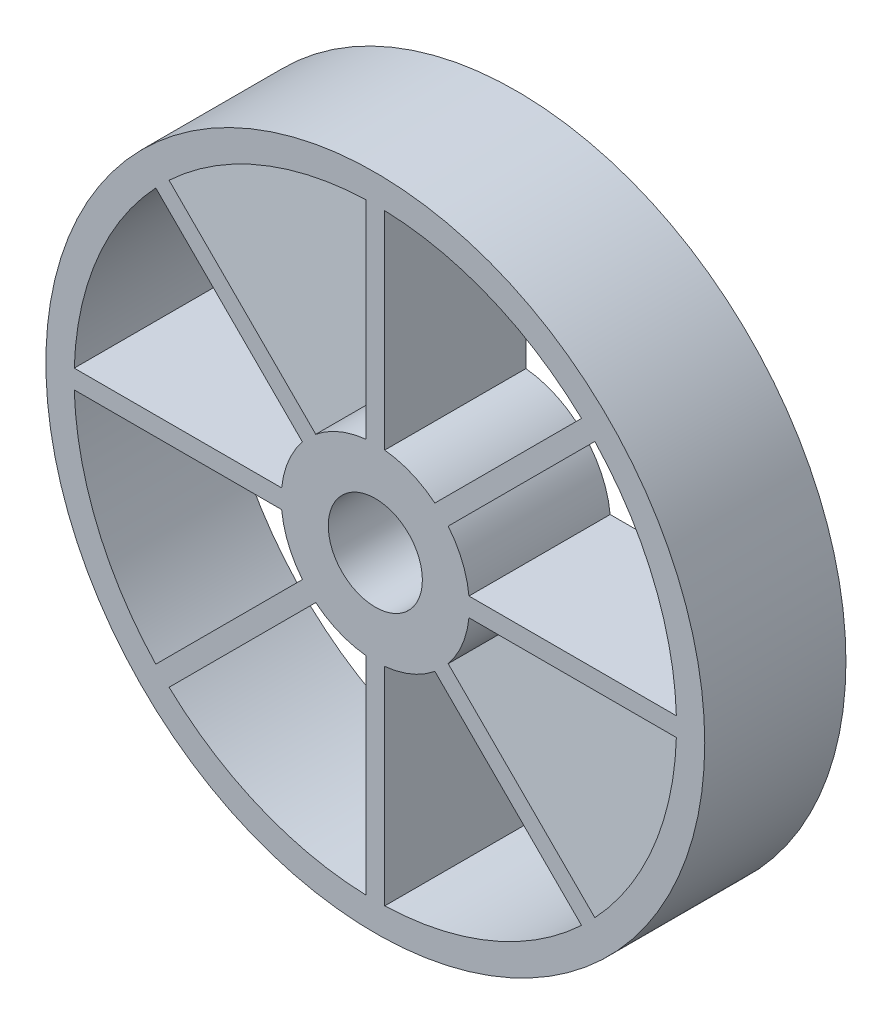
ISO-10303-21;
HEADER;
FILE_DESCRIPTION(('STEP AP214'),'2;1');
FILE_NAME('part.step','',(''),(''),'','','');
FILE_SCHEMA(('AUTOMOTIVE_DESIGN { 1 0 10303 214 1 1 1 1 }'));
ENDSEC;
DATA;
#1=APPLICATION_CONTEXT('core data for automotive mechanical design processes');
#2=APPLICATION_PROTOCOL_DEFINITION('international standard','automotive_design',2000,#1);
#3=PRODUCT_CONTEXT('',#1,'mechanical');
#4=PRODUCT('Part','Part','',(#3));
#5=PRODUCT_RELATED_PRODUCT_CATEGORY('part','',(#4));
#6=PRODUCT_DEFINITION_FORMATION('','',#4);
#7=PRODUCT_DEFINITION_CONTEXT('part definition',#1,'design');
#8=PRODUCT_DEFINITION('design','',#6,#7);
#9=PRODUCT_DEFINITION_SHAPE('','',#8);
#10=(LENGTH_UNIT() NAMED_UNIT(*) SI_UNIT(.MILLI.,.METRE.));
#11=(NAMED_UNIT(*) PLANE_ANGLE_UNIT() SI_UNIT($,.RADIAN.));
#12=(NAMED_UNIT(*) SI_UNIT($,.STERADIAN.) SOLID_ANGLE_UNIT());
#13=UNCERTAINTY_MEASURE_WITH_UNIT(LENGTH_MEASURE(1.E-05),#10,'distance_accuracy_value','');
#14=(GEOMETRIC_REPRESENTATION_CONTEXT(3) GLOBAL_UNCERTAINTY_ASSIGNED_CONTEXT((#13)) GLOBAL_UNIT_ASSIGNED_CONTEXT((#10,
#11,#12)) REPRESENTATION_CONTEXT('',''));
#15=CARTESIAN_POINT('',(0.,0.,0.));
#16=DIRECTION('',(0.,0.,1.));
#17=DIRECTION('',(1.,0.,0.));
#18=AXIS2_PLACEMENT_3D('',#15,#16,#17);
#19=CARTESIAN_POINT('',(0.,0.,15000.));
#20=DIRECTION('',(0.,0.,-1.));
#21=DIRECTION('',(-1.,0.,0.));
#22=AXIS2_PLACEMENT_3D('',#19,#20,#21);
#23=CYLINDRICAL_SURFACE('',#22,10000.);
#24=DIRECTION('',(0.,0.,-1.));
#25=VECTOR('',#24,1.);
#26=CARTESIAN_POINT('',(-7742.73042092175,-6328.51685854853,15000.));
#27=LINE('',#26,#25);
#28=CARTESIAN_POINT('',(-7742.73042092175,-6328.51685854853,15000.));
#29=VERTEX_POINT('',#28);
#30=CARTESIAN_POINT('',(-7742.73042092175,-6328.51685854853,0.));
#31=VERTEX_POINT('',#30);
#32=EDGE_CURVE('E86',#29,#31,#27,.T.);
#33=ORIENTED_EDGE('',*,*,#32,.F.);
#34=CARTESIAN_POINT('',(0.,0.,15000.));
#35=DIRECTION('',(0.,0.,1.));
#36=DIRECTION('',(1.,0.,0.));
#37=AXIS2_PLACEMENT_3D('',#34,#35,#36);
#38=CIRCLE('',#37,10000.);
#39=CARTESIAN_POINT('',(-9949.87437106621,-999.999999999897,15000.));
#40=VERTEX_POINT('',#39);
#41=EDGE_CURVE('E481',#40,#29,#38,.T.);
#42=ORIENTED_EDGE('',*,*,#41,.F.);
#43=DIRECTION('',(0.,0.,-1.));
#44=VECTOR('',#43,1.);
#45=CARTESIAN_POINT('',(-9949.87437106621,-999.999999999897,15000.));
#46=LINE('',#45,#44);
#47=CARTESIAN_POINT('',(-9949.87437106621,-999.999999999897,0.));
#48=VERTEX_POINT('',#47);
#49=EDGE_CURVE('E560',#40,#48,#46,.T.);
#50=ORIENTED_EDGE('',*,*,#49,.T.);
#51=CARTESIAN_POINT('',(0.,0.,0.));
#52=DIRECTION('',(0.,0.,1.));
#53=DIRECTION('',(1.,0.,0.));
#54=AXIS2_PLACEMENT_3D('',#51,#52,#53);
#55=CIRCLE('',#54,10000.);
#56=EDGE_CURVE('E702',#48,#31,#55,.T.);
#57=ORIENTED_EDGE('',*,*,#56,.T.);
#58=EDGE_LOOP('',(#33,#42,#50,#57));
#59=FACE_BOUND('',#58,.T.);
#60=ADVANCED_FACE('F61',(#59),#23,.T.);
#61=CARTESIAN_POINT('',(0.,0.,0.));
#62=DIRECTION('',(0.,0.,1.));
#63=DIRECTION('',(1.,0.,0.));
#64=AXIS2_PLACEMENT_3D('',#61,#62,#63);
#65=CYLINDRICAL_SURFACE('',#64,32000.);
#66=DIRECTION('',(0.,0.,-1.));
#67=VECTOR('',#66,1.);
#68=CARTESIAN_POINT('',(-23323.4725369845,-21909.2589746112,15000.));
#69=LINE('',#68,#67);
#70=CARTESIAN_POINT('',(-23323.4725369845,-21909.2589746112,15000.));
#71=VERTEX_POINT('',#70);
#72=CARTESIAN_POINT('',(-23323.4725369845,-21909.2589746112,0.));
#73=VERTEX_POINT('',#72);
#74=EDGE_CURVE('E277',#71,#73,#69,.T.);
#75=ORIENTED_EDGE('',*,*,#74,.T.);
#76=CARTESIAN_POINT('',(0.,0.,0.));
#77=DIRECTION('',(0.,0.,1.));
#78=DIRECTION('',(1.,0.,0.));
#79=AXIS2_PLACEMENT_3D('',#76,#77,#78);
#80=CIRCLE('',#79,32000.);
#81=CARTESIAN_POINT('',(-31984.371183439,-999.999999999879,0.));
#82=VERTEX_POINT('',#81);
#83=EDGE_CURVE('E289',#82,#73,#80,.T.);
#84=ORIENTED_EDGE('',*,*,#83,.F.);
#85=DIRECTION('',(0.,0.,-1.));
#86=VECTOR('',#85,1.);
#87=CARTESIAN_POINT('',(-31984.3711834398,-999.999999999879,15000.));
#88=LINE('',#87,#86);
#89=CARTESIAN_POINT('',(-31984.3711834398,-999.999999999879,15000.));
#90=VERTEX_POINT('',#89);
#91=EDGE_CURVE('E565',#90,#82,#88,.T.);
#92=ORIENTED_EDGE('',*,*,#91,.F.);
#93=CARTESIAN_POINT('',(0.,0.,15000.));
#94=DIRECTION('',(0.,0.,1.));
#95=DIRECTION('',(1.,0.,0.));
#96=AXIS2_PLACEMENT_3D('',#93,#94,#95);
#97=CIRCLE('',#96,32000.);
#98=EDGE_CURVE('E291',#90,#71,#97,.T.);
#99=ORIENTED_EDGE('',*,*,#98,.T.);
#100=EDGE_LOOP('',(#75,#84,#92,#99));
#101=FACE_BOUND('',#100,.T.);
#102=ADVANCED_FACE('F287',(#101),#65,.F.);
#103=DIRECTION('',(0.,0.,-1.));
#104=VECTOR('',#103,1.);
#105=CARTESIAN_POINT('',(7742.7304209217,6328.51685854858,15000.));
#106=LINE('',#105,#104);
#107=CARTESIAN_POINT('',(7742.7304209217,6328.51685854858,15000.));
#108=VERTEX_POINT('',#107);
#109=CARTESIAN_POINT('',(7742.7304209217,6328.51685854858,0.));
#110=VERTEX_POINT('',#109);
#111=EDGE_CURVE('E704',#108,#110,#106,.T.);
#112=ORIENTED_EDGE('',*,*,#111,.F.);
#113=CARTESIAN_POINT('',(9949.8743710662,999.999999999967,15000.));
#114=VERTEX_POINT('',#113);
#115=EDGE_CURVE('E482',#114,#108,#38,.T.);
#116=ORIENTED_EDGE('',*,*,#115,.F.);
#117=DIRECTION('',(0.,0.,-1.));
#118=VECTOR('',#117,1.);
#119=CARTESIAN_POINT('',(9949.8743710662,999.999999999967,15000.));
#120=LINE('',#119,#118);
#121=CARTESIAN_POINT('',(9949.8743710662,999.999999999967,0.));
#122=VERTEX_POINT('',#121);
#123=EDGE_CURVE('E501',#114,#122,#120,.T.);
#124=ORIENTED_EDGE('',*,*,#123,.T.);
#125=EDGE_CURVE('E657',#122,#110,#55,.T.);
#126=ORIENTED_EDGE('',*,*,#125,.T.);
#127=EDGE_LOOP('',(#112,#116,#124,#126));
#128=FACE_BOUND('',#127,.T.);
#129=ADVANCED_FACE('F403',(#128),#23,.T.);
#130=DIRECTION('',(0.,0.,-1.));
#131=VECTOR('',#130,1.);
#132=CARTESIAN_POINT('',(23323.4725369845,21909.2589746112,15000.));
#133=LINE('',#132,#131);
#134=CARTESIAN_POINT('',(23323.4725369845,21909.2589746112,15000.));
#135=VERTEX_POINT('',#134);
#136=CARTESIAN_POINT('',(23323.4725369845,21909.2589746112,0.));
#137=VERTEX_POINT('',#136);
#138=EDGE_CURVE('E713',#135,#137,#133,.T.);
#139=ORIENTED_EDGE('',*,*,#138,.T.);
#140=CARTESIAN_POINT('',(31984.371183439,999.999999999875,0.));
#141=VERTEX_POINT('',#140);
#142=EDGE_CURVE('E315',#141,#137,#80,.T.);
#143=ORIENTED_EDGE('',*,*,#142,.F.);
#144=DIRECTION('',(0.,0.,-1.));
#145=VECTOR('',#144,1.);
#146=CARTESIAN_POINT('',(31984.3711834398,999.999999999875,15000.));
#147=LINE('',#146,#145);
#148=CARTESIAN_POINT('',(31984.3711834398,999.999999999875,15000.));
#149=VERTEX_POINT('',#148);
#150=EDGE_CURVE('E506',#149,#141,#147,.T.);
#151=ORIENTED_EDGE('',*,*,#150,.F.);
#152=EDGE_CURVE('E632',#149,#135,#97,.T.);
#153=ORIENTED_EDGE('',*,*,#152,.T.);
#154=EDGE_LOOP('',(#139,#143,#151,#153));
#155=FACE_BOUND('',#154,.T.);
#156=ADVANCED_FACE('F408',(#155),#65,.F.);
#157=DIRECTION('',(0.,0.,-1.));
#158=VECTOR('',#157,1.);
#159=CARTESIAN_POINT('',(6328.51685854855,-7742.73042092172,15000.));
#160=LINE('',#159,#158);
#161=CARTESIAN_POINT('',(6328.51685854856,-7742.73042092172,15000.));
#162=VERTEX_POINT('',#161);
#163=CARTESIAN_POINT('',(6328.51685854856,-7742.73042092172,0.));
#164=VERTEX_POINT('',#163);
#165=EDGE_CURVE('E460',#162,#164,#160,.T.);
#166=ORIENTED_EDGE('',*,*,#165,.F.);
#167=CARTESIAN_POINT('',(999.999999999931,-9949.87437106621,15000.));
#168=VERTEX_POINT('',#167);
#169=EDGE_CURVE('E463',#168,#162,#38,.T.);
#170=ORIENTED_EDGE('',*,*,#169,.F.);
#171=DIRECTION('',(0.,0.,-1.));
#172=VECTOR('',#171,1.);
#173=CARTESIAN_POINT('',(999.999999999931,-9949.87437106621,15000.));
#174=LINE('',#173,#172);
#175=CARTESIAN_POINT('',(999.999999999931,-9949.87437106621,0.));
#176=VERTEX_POINT('',#175);
#177=EDGE_CURVE('E532',#168,#176,#174,.T.);
#178=ORIENTED_EDGE('',*,*,#177,.T.);
#179=EDGE_CURVE('E465',#176,#164,#55,.T.);
#180=ORIENTED_EDGE('',*,*,#179,.T.);
#181=EDGE_LOOP('',(#166,#170,#178,#180));
#182=FACE_BOUND('',#181,.T.);
#183=ADVANCED_FACE('F412',(#182),#23,.T.);
#184=DIRECTION('',(0.,0.,-1.));
#185=VECTOR('',#184,1.);
#186=CARTESIAN_POINT('',(21909.2589746112,-23323.4725369845,15000.));
#187=LINE('',#186,#185);
#188=CARTESIAN_POINT('',(21909.2589746112,-23323.4725369845,15000.));
#189=VERTEX_POINT('',#188);
#190=CARTESIAN_POINT('',(21909.2589746112,-23323.4725369845,0.));
#191=VERTEX_POINT('',#190);
#192=EDGE_CURVE('E469',#189,#191,#187,.T.);
#193=ORIENTED_EDGE('',*,*,#192,.T.);
#194=CARTESIAN_POINT('',(999.999999999877,-31984.371183439,0.));
#195=VERTEX_POINT('',#194);
#196=EDGE_CURVE('E304',#195,#191,#80,.T.);
#197=ORIENTED_EDGE('',*,*,#196,.F.);
#198=DIRECTION('',(0.,0.,-1.));
#199=VECTOR('',#198,1.);
#200=CARTESIAN_POINT('',(999.999999999877,-31984.3711834398,15000.));
#201=LINE('',#200,#199);
#202=CARTESIAN_POINT('',(999.999999999877,-31984.3711834398,15000.));
#203=VERTEX_POINT('',#202);
#204=EDGE_CURVE('E536',#203,#195,#201,.T.);
#205=ORIENTED_EDGE('',*,*,#204,.F.);
#206=EDGE_CURVE('E628',#203,#189,#97,.T.);
#207=ORIENTED_EDGE('',*,*,#206,.T.);
#208=EDGE_LOOP('',(#193,#197,#205,#207));
#209=FACE_BOUND('',#208,.T.);
#210=ADVANCED_FACE('F446',(#209),#65,.F.);
#211=CARTESIAN_POINT('',(7742.73042092166,-6328.51685854864,15000.));
#212=VERTEX_POINT('',#211);
#213=CARTESIAN_POINT('',(9949.8743710662,-1000.00000000003,15000.));
#214=VERTEX_POINT('',#213);
#215=EDGE_CURVE('E480',#212,#214,#38,.T.);
#216=ORIENTED_EDGE('',*,*,#215,.F.);
#217=DIRECTION('',(0.,0.,-1.));
#218=VECTOR('',#217,1.);
#219=CARTESIAN_POINT('',(7742.73042092166,-6328.51685854863,15000.));
#220=LINE('',#219,#218);
#221=CARTESIAN_POINT('',(7742.73042092166,-6328.51685854863,0.));
#222=VERTEX_POINT('',#221);
#223=EDGE_CURVE('E488',#212,#222,#220,.T.);
#224=ORIENTED_EDGE('',*,*,#223,.T.);
#225=CARTESIAN_POINT('',(9949.8743710662,-1000.00000000003,0.));
#226=VERTEX_POINT('',#225);
#227=EDGE_CURVE('E658',#222,#226,#55,.T.);
#228=ORIENTED_EDGE('',*,*,#227,.T.);
#229=DIRECTION('',(0.,0.,-1.));
#230=VECTOR('',#229,1.);
#231=CARTESIAN_POINT('',(9949.87437106619,-1000.00000000003,15000.));
#232=LINE('',#231,#230);
#233=EDGE_CURVE('E514',#214,#226,#232,.T.);
#234=ORIENTED_EDGE('',*,*,#233,.F.);
#235=EDGE_LOOP('',(#216,#224,#228,#234));
#236=FACE_BOUND('',#235,.T.);
#237=ADVANCED_FACE('F441',(#236),#23,.T.);
#238=CARTESIAN_POINT('',(23323.4725369837,-21909.2589746108,0.));
#239=VERTEX_POINT('',#238);
#240=CARTESIAN_POINT('',(31984.3711834398,-1000.00000000013,0.));
#241=VERTEX_POINT('',#240);
#242=EDGE_CURVE('E314',#239,#241,#80,.T.);
#243=ORIENTED_EDGE('',*,*,#242,.F.);
#244=DIRECTION('',(0.,0.,-1.));
#245=VECTOR('',#244,1.);
#246=CARTESIAN_POINT('',(23323.4725369843,-21909.2589746114,15000.));
#247=LINE('',#246,#245);
#248=CARTESIAN_POINT('',(23323.4725369843,-21909.2589746114,15000.));
#249=VERTEX_POINT('',#248);
#250=EDGE_CURVE('E495',#249,#239,#247,.T.);
#251=ORIENTED_EDGE('',*,*,#250,.F.);
#252=CARTESIAN_POINT('',(31984.3711834398,-1000.00000000013,15000.));
#253=VERTEX_POINT('',#252);
#254=EDGE_CURVE('E631',#249,#253,#97,.T.);
#255=ORIENTED_EDGE('',*,*,#254,.T.);
#256=DIRECTION('',(0.,0.,-1.));
#257=VECTOR('',#256,1.);
#258=CARTESIAN_POINT('',(31984.3711834398,-1000.00000000013,15000.));
#259=LINE('',#258,#257);
#260=EDGE_CURVE('E510',#253,#241,#259,.T.);
#261=ORIENTED_EDGE('',*,*,#260,.T.);
#262=EDGE_LOOP('',(#243,#251,#255,#261));
#263=FACE_BOUND('',#262,.T.);
#264=ADVANCED_FACE('F439',(#263),#65,.F.);
#265=CARTESIAN_POINT('',(-6328.51685854866,-7742.73042092164,15000.));
#266=VERTEX_POINT('',#265);
#267=CARTESIAN_POINT('',(-1000.00000000007,-9949.87437106619,15000.));
#268=VERTEX_POINT('',#267);
#269=EDGE_CURVE('E72',#266,#268,#38,.T.);
#270=ORIENTED_EDGE('',*,*,#269,.F.);
#271=DIRECTION('',(0.,0.,-1.));
#272=VECTOR('',#271,1.);
#273=CARTESIAN_POINT('',(-6328.51685854866,-7742.73042092164,15000.));
#274=LINE('',#273,#272);
#275=CARTESIAN_POINT('',(-6328.51685854866,-7742.73042092164,0.));
#276=VERTEX_POINT('',#275);
#277=EDGE_CURVE('E779',#266,#276,#274,.T.);
#278=ORIENTED_EDGE('',*,*,#277,.T.);
#279=CARTESIAN_POINT('',(-1000.00000000007,-9949.87437106619,0.));
#280=VERTEX_POINT('',#279);
#281=EDGE_CURVE('E659',#276,#280,#55,.T.);
#282=ORIENTED_EDGE('',*,*,#281,.T.);
#283=DIRECTION('',(0.,0.,-1.));
#284=VECTOR('',#283,1.);
#285=CARTESIAN_POINT('',(-1000.00000000007,-9949.87437106619,15000.));
#286=LINE('',#285,#284);
#287=EDGE_CURVE('E526',#268,#280,#286,.T.);
#288=ORIENTED_EDGE('',*,*,#287,.F.);
#289=EDGE_LOOP('',(#270,#278,#282,#288));
#290=FACE_BOUND('',#289,.T.);
#291=ADVANCED_FACE('F434',(#290),#23,.T.);
#292=CARTESIAN_POINT('',(-21909.2589746108,-23323.4725369837,0.));
#293=VERTEX_POINT('',#292);
#294=CARTESIAN_POINT('',(-1000.00000000013,-31984.3711834398,0.));
#295=VERTEX_POINT('',#294);
#296=EDGE_CURVE('E302',#293,#295,#80,.T.);
#297=ORIENTED_EDGE('',*,*,#296,.F.);
#298=DIRECTION('',(0.,0.,-1.));
#299=VECTOR('',#298,1.);
#300=CARTESIAN_POINT('',(-21909.2589746114,-23323.4725369843,15000.));
#301=LINE('',#300,#299);
#302=CARTESIAN_POINT('',(-21909.2589746114,-23323.4725369843,15000.));
#303=VERTEX_POINT('',#302);
#304=EDGE_CURVE('E293',#303,#293,#301,.T.);
#305=ORIENTED_EDGE('',*,*,#304,.F.);
#306=CARTESIAN_POINT('',(-1000.00000000013,-31984.3711834398,15000.));
#307=VERTEX_POINT('',#306);
#308=EDGE_CURVE('E341',#303,#307,#97,.T.);
#309=ORIENTED_EDGE('',*,*,#308,.T.);
#310=DIRECTION('',(0.,0.,-1.));
#311=VECTOR('',#310,1.);
#312=CARTESIAN_POINT('',(-1000.00000000013,-31984.3711834398,15000.));
#313=LINE('',#312,#311);
#314=EDGE_CURVE('E540',#307,#295,#313,.T.);
#315=ORIENTED_EDGE('',*,*,#314,.T.);
#316=EDGE_LOOP('',(#297,#305,#309,#315));
#317=FACE_BOUND('',#316,.T.);
#318=ADVANCED_FACE('F431',(#317),#65,.F.);
#319=DIRECTION('',(0.,0.,-1.));
#320=VECTOR('',#319,1.);
#321=CARTESIAN_POINT('',(-9949.87437106619,1000.0000000001,15000.));
#322=LINE('',#321,#320);
#323=CARTESIAN_POINT('',(-9949.87437106619,1000.0000000001,15000.));
#324=VERTEX_POINT('',#323);
#325=CARTESIAN_POINT('',(-9949.87437106619,1000.0000000001,0.));
#326=VERTEX_POINT('',#325);
#327=EDGE_CURVE('E554',#324,#326,#322,.T.);
#328=ORIENTED_EDGE('',*,*,#327,.F.);
#329=CARTESIAN_POINT('',(-7742.73042092161,6328.51685854869,15000.));
#330=VERTEX_POINT('',#329);
#331=EDGE_CURVE('E71',#330,#324,#38,.T.);
#332=ORIENTED_EDGE('',*,*,#331,.F.);
#333=DIRECTION('',(0.,0.,-1.));
#334=VECTOR('',#333,1.);
#335=CARTESIAN_POINT('',(-7742.73042092161,6328.51685854869,15000.));
#336=LINE('',#335,#334);
#337=CARTESIAN_POINT('',(-7742.73042092161,6328.51685854869,0.));
#338=VERTEX_POINT('',#337);
#339=EDGE_CURVE('E586',#330,#338,#336,.T.);
#340=ORIENTED_EDGE('',*,*,#339,.T.);
#341=EDGE_CURVE('E760',#338,#326,#55,.T.);
#342=ORIENTED_EDGE('',*,*,#341,.T.);
#343=EDGE_LOOP('',(#328,#332,#340,#342));
#344=FACE_BOUND('',#343,.T.);
#345=ADVANCED_FACE('F426',(#344),#23,.T.);
#346=DIRECTION('',(0.,0.,-1.));
#347=VECTOR('',#346,1.);
#348=CARTESIAN_POINT('',(-31984.3711834398,1000.00000000011,15000.));
#349=LINE('',#348,#347);
#350=CARTESIAN_POINT('',(-31984.3711834398,1000.00000000011,15000.));
#351=VERTEX_POINT('',#350);
#352=CARTESIAN_POINT('',(-31984.3711834398,1000.00000000011,0.));
#353=VERTEX_POINT('',#352);
#354=EDGE_CURVE('E568',#351,#353,#349,.T.);
#355=ORIENTED_EDGE('',*,*,#354,.T.);
#356=CARTESIAN_POINT('',(-23323.4725369837,21909.2589746108,0.));
#357=VERTEX_POINT('',#356);
#358=EDGE_CURVE('E301',#357,#353,#80,.T.);
#359=ORIENTED_EDGE('',*,*,#358,.F.);
#360=DIRECTION('',(0.,0.,-1.));
#361=VECTOR('',#360,1.);
#362=CARTESIAN_POINT('',(-23323.4725369843,21909.2589746114,15000.));
#363=LINE('',#362,#361);
#364=CARTESIAN_POINT('',(-23323.4725369843,21909.2589746114,15000.));
#365=VERTEX_POINT('',#364);
#366=EDGE_CURVE('E591',#365,#357,#363,.T.);
#367=ORIENTED_EDGE('',*,*,#366,.F.);
#368=EDGE_CURVE('E339',#365,#351,#97,.T.);
#369=ORIENTED_EDGE('',*,*,#368,.T.);
#370=EDGE_LOOP('',(#355,#359,#367,#369));
#371=FACE_BOUND('',#370,.T.);
#372=ADVANCED_FACE('F423',(#371),#65,.F.);
#373=DIRECTION('',(0.,0.,-1.));
#374=VECTOR('',#373,1.);
#375=CARTESIAN_POINT('',(-6328.5168585485,7742.73042092177,15000.));
#376=LINE('',#375,#374);
#377=CARTESIAN_POINT('',(-6328.5168585485,7742.73042092177,15000.));
#378=VERTEX_POINT('',#377);
#379=CARTESIAN_POINT('',(-6328.5168585485,7742.73042092177,0.));
#380=VERTEX_POINT('',#379);
#381=EDGE_CURVE('E581',#378,#380,#376,.T.);
#382=ORIENTED_EDGE('',*,*,#381,.F.);
#383=CARTESIAN_POINT('',(-1000.,9949.8743710662,15000.));
#384=VERTEX_POINT('',#383);
#385=EDGE_CURVE('E12',#384,#378,#38,.T.);
#386=ORIENTED_EDGE('',*,*,#385,.F.);
#387=DIRECTION('',(0.,0.,-1.));
#388=VECTOR('',#387,1.);
#389=CARTESIAN_POINT('',(-999.999999999999,9949.8743710662,15000.));
#390=LINE('',#389,#388);
#391=CARTESIAN_POINT('',(-999.999999999999,9949.8743710662,0.));
#392=VERTEX_POINT('',#391);
#393=EDGE_CURVE('E364',#384,#392,#390,.T.);
#394=ORIENTED_EDGE('',*,*,#393,.T.);
#395=EDGE_CURVE('E65',#392,#380,#55,.T.);
#396=ORIENTED_EDGE('',*,*,#395,.T.);
#397=EDGE_LOOP('',(#382,#386,#394,#396));
#398=FACE_BOUND('',#397,.T.);
#399=ADVANCED_FACE('F416',(#398),#23,.T.);
#400=DIRECTION('',(0.,0.,-1.));
#401=VECTOR('',#400,1.);
#402=CARTESIAN_POINT('',(-21909.2589746113,23323.4725369845,15000.));
#403=LINE('',#402,#401);
#404=CARTESIAN_POINT('',(-21909.2589746113,23323.4725369845,15000.));
#405=VERTEX_POINT('',#404);
#406=CARTESIAN_POINT('',(-21909.2589746113,23323.4725369845,0.));
#407=VERTEX_POINT('',#406);
#408=EDGE_CURVE('E595',#405,#407,#403,.T.);
#409=ORIENTED_EDGE('',*,*,#408,.T.);
#410=CARTESIAN_POINT('',(-999.999999999873,31984.3711834398,0.));
#411=VERTEX_POINT('',#410);
#412=EDGE_CURVE('E308',#411,#407,#80,.T.);
#413=ORIENTED_EDGE('',*,*,#412,.F.);
#414=DIRECTION('',(0.,0.,-1.));
#415=VECTOR('',#414,1.);
#416=CARTESIAN_POINT('',(-999.999999999873,31984.3711834398,15000.));
#417=LINE('',#416,#415);
#418=CARTESIAN_POINT('',(-999.999999999873,31984.371183439,15000.));
#419=VERTEX_POINT('',#418);
#420=EDGE_CURVE('E368',#419,#411,#417,.T.);
#421=ORIENTED_EDGE('',*,*,#420,.F.);
#422=EDGE_CURVE('E333',#419,#405,#97,.T.);
#423=ORIENTED_EDGE('',*,*,#422,.T.);
#424=EDGE_LOOP('',(#409,#413,#421,#423));
#425=FACE_BOUND('',#424,.T.);
#426=ADVANCED_FACE('F414',(#425),#65,.F.);
#427=CARTESIAN_POINT('',(6328.51685854861,7742.73042092168,15000.));
#428=VERTEX_POINT('',#427);
#429=CARTESIAN_POINT('',(1000.,9949.8743710662,15000.));
#430=VERTEX_POINT('',#429);
#431=EDGE_CURVE('E651',#428,#430,#38,.T.);
#432=ORIENTED_EDGE('',*,*,#431,.F.);
#433=DIRECTION('',(0.,0.,-1.));
#434=VECTOR('',#433,1.);
#435=CARTESIAN_POINT('',(6328.51685854861,7742.73042092168,15000.));
#436=LINE('',#435,#434);
#437=CARTESIAN_POINT('',(6328.51685854861,7742.73042092168,0.));
#438=VERTEX_POINT('',#437);
#439=EDGE_CURVE('E661',#428,#438,#436,.T.);
#440=ORIENTED_EDGE('',*,*,#439,.T.);
#441=CARTESIAN_POINT('',(1000.,9949.8743710662,0.));
#442=VERTEX_POINT('',#441);
#443=EDGE_CURVE('E380',#438,#442,#55,.T.);
#444=ORIENTED_EDGE('',*,*,#443,.T.);
#445=DIRECTION('',(0.,0.,-1.));
#446=VECTOR('',#445,1.);
#447=CARTESIAN_POINT('',(1000.,9949.8743710662,15000.));
#448=LINE('',#447,#446);
#449=EDGE_CURVE('E352',#430,#442,#448,.T.);
#450=ORIENTED_EDGE('',*,*,#449,.F.);
#451=EDGE_LOOP('',(#432,#440,#444,#450));
#452=FACE_BOUND('',#451,.T.);
#453=ADVANCED_FACE('F63',(#452),#23,.T.);
#454=CARTESIAN_POINT('',(0.,0.,15000.));
#455=DIRECTION('',(0.,0.,1.));
#456=DIRECTION('',(1.,0.,0.));
#457=AXIS2_PLACEMENT_3D('',#454,#455,#456);
#458=PLANE('',#457);
#459=DIRECTION('',(-0.707106781186549,-0.707106781186546,0.));
#460=VECTOR('',#459,1.);
#461=CARTESIAN_POINT('',(-6328.51685854866,-7742.73042092164,15000.));
#462=LINE('',#461,#460);
#463=EDGE_CURVE('E283',#266,#303,#462,.T.);
#464=ORIENTED_EDGE('',*,*,#463,.F.);
#465=ORIENTED_EDGE('',*,*,#269,.T.);
#466=DIRECTION('',(0.,-1.,0.));
#467=VECTOR('',#466,1.);
#468=CARTESIAN_POINT('',(-1000.00000000007,-9949.87437106619,15000.));
#469=LINE('',#468,#467);
#470=EDGE_CURVE('E535',#268,#307,#469,.T.);
#471=ORIENTED_EDGE('',*,*,#470,.T.);
#472=ORIENTED_EDGE('',*,*,#308,.F.);
#473=EDGE_LOOP('',(#464,#465,#471,#472));
#474=FACE_BOUND('',#473,.T.);
#475=DIRECTION('',(0.707106781186551,0.707106781186544,0.));
#476=VECTOR('',#475,1.);
#477=CARTESIAN_POINT('',(6328.51685854861,7742.73042092168,15000.));
#478=LINE('',#477,#476);
#479=CARTESIAN_POINT('',(21909.2589746114,23323.4725369843,15000.));
#480=VERTEX_POINT('',#479);
#481=EDGE_CURVE('E671',#428,#480,#478,.T.);
#482=ORIENTED_EDGE('',*,*,#481,.F.);
#483=ORIENTED_EDGE('',*,*,#431,.T.);
#484=DIRECTION('',(0.,1.,0.));
#485=VECTOR('',#484,1.);
#486=CARTESIAN_POINT('',(1000.,9949.8743710662,15000.));
#487=LINE('',#486,#485);
#488=CARTESIAN_POINT('',(1000.0000000001,31984.371183439,15000.));
#489=VERTEX_POINT('',#488);
#490=EDGE_CURVE('E343',#430,#489,#487,.T.);
#491=ORIENTED_EDGE('',*,*,#490,.T.);
#492=EDGE_CURVE('E609',#480,#489,#97,.T.);
#493=ORIENTED_EDGE('',*,*,#492,.F.);
#494=EDGE_LOOP('',(#482,#483,#491,#493));
#495=FACE_BOUND('',#494,.T.);
#496=DIRECTION('',(0.707106781186545,-0.70710678118655,0.));
#497=VECTOR('',#496,1.);
#498=CARTESIAN_POINT('',(7742.73042092166,-6328.51685854863,15000.));
#499=LINE('',#498,#497);
#500=EDGE_CURVE('E487',#212,#249,#499,.T.);
#501=ORIENTED_EDGE('',*,*,#500,.F.);
#502=ORIENTED_EDGE('',*,*,#215,.T.);
#503=DIRECTION('',(1.,0.,0.));
#504=VECTOR('',#503,1.);
#505=CARTESIAN_POINT('',(9949.87437106619,-1000.00000000003,15000.));
#506=LINE('',#505,#504);
#507=EDGE_CURVE('E505',#214,#253,#506,.T.);
#508=ORIENTED_EDGE('',*,*,#507,.T.);
#509=ORIENTED_EDGE('',*,*,#254,.F.);
#510=EDGE_LOOP('',(#501,#502,#508,#509));
#511=FACE_BOUND('',#510,.T.);
#512=DIRECTION('',(1.,0.,0.));
#513=VECTOR('',#512,1.);
#514=CARTESIAN_POINT('',(9949.8743710662,999.999999999967,15000.));
#515=LINE('',#514,#513);
#516=EDGE_CURVE('E523',#114,#149,#515,.T.);
#517=ORIENTED_EDGE('',*,*,#516,.F.);
#518=ORIENTED_EDGE('',*,*,#115,.T.);
#519=DIRECTION('',(0.707106781186551,0.707106781186544,0.));
#520=VECTOR('',#519,1.);
#521=CARTESIAN_POINT('',(7742.7304209217,6328.51685854858,15000.));
#522=LINE('',#521,#520);
#523=EDGE_CURVE('E664',#108,#135,#522,.T.);
#524=ORIENTED_EDGE('',*,*,#523,.T.);
#525=ORIENTED_EDGE('',*,*,#152,.F.);
#526=EDGE_LOOP('',(#517,#518,#524,#525));
#527=FACE_BOUND('',#526,.T.);
#528=DIRECTION('',(0.,-1.,0.));
#529=VECTOR('',#528,1.);
#530=CARTESIAN_POINT('',(999.999999999931,-9949.87437106621,15000.));
#531=LINE('',#530,#529);
#532=EDGE_CURVE('E478',#168,#203,#531,.T.);
#533=ORIENTED_EDGE('',*,*,#532,.F.);
#534=ORIENTED_EDGE('',*,*,#169,.T.);
#535=DIRECTION('',(0.707106781186545,-0.70710678118655,0.));
#536=VECTOR('',#535,1.);
#537=CARTESIAN_POINT('',(6328.51685854855,-7742.73042092172,15000.));
#538=LINE('',#537,#536);
#539=EDGE_CURVE('E476',#162,#189,#538,.T.);
#540=ORIENTED_EDGE('',*,*,#539,.T.);
#541=ORIENTED_EDGE('',*,*,#206,.F.);
#542=EDGE_LOOP('',(#533,#534,#540,#541));
#543=FACE_BOUND('',#542,.T.);
#544=DIRECTION('',(-1.,0.,0.));
#545=VECTOR('',#544,1.);
#546=CARTESIAN_POINT('',(-9949.87437106621,-999.999999999897,15000.));
#547=LINE('',#546,#545);
#548=EDGE_CURVE('E578',#40,#90,#547,.T.);
#549=ORIENTED_EDGE('',*,*,#548,.F.);
#550=ORIENTED_EDGE('',*,*,#41,.T.);
#551=DIRECTION('',(-0.707106781186549,-0.707106781186546,0.));
#552=VECTOR('',#551,1.);
#553=CARTESIAN_POINT('',(-7742.73042092175,-6328.51685854853,15000.));
#554=LINE('',#553,#552);
#555=EDGE_CURVE('E777',#29,#71,#554,.T.);
#556=ORIENTED_EDGE('',*,*,#555,.T.);
#557=ORIENTED_EDGE('',*,*,#98,.F.);
#558=EDGE_LOOP('',(#549,#550,#556,#557));
#559=FACE_BOUND('',#558,.T.);
#560=DIRECTION('',(-0.707106781186548,0.707106781186547,0.));
#561=VECTOR('',#560,1.);
#562=CARTESIAN_POINT('',(-7742.73042092161,6328.51685854869,15000.));
#563=LINE('',#562,#561);
#564=EDGE_CURVE('E606',#330,#365,#563,.T.);
#565=ORIENTED_EDGE('',*,*,#564,.F.);
#566=ORIENTED_EDGE('',*,*,#331,.T.);
#567=DIRECTION('',(-1.,0.,0.));
#568=VECTOR('',#567,1.);
#569=CARTESIAN_POINT('',(-9949.87437106619,1000.0000000001,15000.));
#570=LINE('',#569,#568);
#571=EDGE_CURVE('E564',#324,#351,#570,.T.);
#572=ORIENTED_EDGE('',*,*,#571,.T.);
#573=ORIENTED_EDGE('',*,*,#368,.F.);
#574=EDGE_LOOP('',(#565,#566,#572,#573));
#575=FACE_BOUND('',#574,.T.);
#576=ORIENTED_EDGE('',*,*,#385,.T.);
#577=DIRECTION('',(-0.707106781186548,0.707106781186547,0.));
#578=VECTOR('',#577,1.);
#579=CARTESIAN_POINT('',(-6328.5168585485,7742.73042092177,15000.));
#580=LINE('',#579,#578);
#581=EDGE_CURVE('E590',#378,#405,#580,.T.);
#582=ORIENTED_EDGE('',*,*,#581,.T.);
#583=ORIENTED_EDGE('',*,*,#422,.F.);
#584=DIRECTION('',(0.,1.,0.));
#585=VECTOR('',#584,1.);
#586=CARTESIAN_POINT('',(-1000.,9949.8743710662,15000.));
#587=LINE('',#586,#585);
#588=EDGE_CURVE('E347',#384,#419,#587,.T.);
#589=ORIENTED_EDGE('',*,*,#588,.F.);
#590=EDGE_LOOP('',(#576,#582,#583,#589));
#591=FACE_BOUND('',#590,.T.);
#592=CARTESIAN_POINT('',(0.,0.,15000.));
#593=DIRECTION('',(0.,0.,1.));
#594=DIRECTION('',(1.,0.,0.));
#595=AXIS2_PLACEMENT_3D('',#592,#593,#594);
#596=CIRCLE('',#595,5000.);
#597=CARTESIAN_POINT('',(5000.,0.,15000.));
#598=VERTEX_POINT('',#597);
#599=EDGE_CURVE('E376',#598,#598,#596,.T.);
#600=ORIENTED_EDGE('',*,*,#599,.F.);
#601=EDGE_LOOP('',(#600));
#602=FACE_BOUND('',#601,.T.);
#603=CARTESIAN_POINT('',(0.,0.,15000.));
#604=DIRECTION('',(0.,0.,1.));
#605=DIRECTION('',(1.,0.,0.));
#606=AXIS2_PLACEMENT_3D('',#603,#604,#605);
#607=CIRCLE('',#606,35000.);
#608=CARTESIAN_POINT('',(35000.,0.,15000.));
#609=VERTEX_POINT('',#608);
#610=EDGE_CURVE('E326',#609,#609,#607,.T.);
#611=ORIENTED_EDGE('',*,*,#610,.T.);
#612=EDGE_LOOP('',(#611));
#613=FACE_BOUND('',#612,.T.);
#614=ADVANCED_FACE('F399',(#474,#495,#511,#527,#543,#559,#575,#591,#602,#613),#458,.T.);
#615=CARTESIAN_POINT('',(0.,0.,0.));
#616=DIRECTION('',(0.,0.,1.));
#617=DIRECTION('',(1.,0.,0.));
#618=AXIS2_PLACEMENT_3D('',#615,#616,#617);
#619=PLANE('',#618);
#620=ORIENTED_EDGE('',*,*,#281,.F.);
#621=DIRECTION('',(-0.707106781186549,-0.707106781186546,0.));
#622=VECTOR('',#621,1.);
#623=CARTESIAN_POINT('',(-6328.51685854866,-7742.73042092164,0.));
#624=LINE('',#623,#622);
#625=EDGE_CURVE('E282',#276,#293,#624,.T.);
#626=ORIENTED_EDGE('',*,*,#625,.T.);
#627=ORIENTED_EDGE('',*,*,#296,.T.);
#628=DIRECTION('',(0.,-1.,0.));
#629=VECTOR('',#628,1.);
#630=CARTESIAN_POINT('',(-1000.00000000007,-9949.87437106619,0.));
#631=LINE('',#630,#629);
#632=EDGE_CURVE('E547',#280,#295,#631,.T.);
#633=ORIENTED_EDGE('',*,*,#632,.F.);
#634=EDGE_LOOP('',(#620,#626,#627,#633));
#635=FACE_BOUND('',#634,.T.);
#636=ORIENTED_EDGE('',*,*,#443,.F.);
#637=DIRECTION('',(0.707106781186551,0.707106781186544,0.));
#638=VECTOR('',#637,1.);
#639=CARTESIAN_POINT('',(6328.51685854861,7742.73042092168,0.));
#640=LINE('',#639,#638);
#641=CARTESIAN_POINT('',(21909.2589746108,23323.4725369837,0.));
#642=VERTEX_POINT('',#641);
#643=EDGE_CURVE('E470',#438,#642,#640,.T.);
#644=ORIENTED_EDGE('',*,*,#643,.T.);
#645=CARTESIAN_POINT('',(1000.0000000001,31984.371183439,0.));
#646=VERTEX_POINT('',#645);
#647=EDGE_CURVE('E309',#642,#646,#80,.T.);
#648=ORIENTED_EDGE('',*,*,#647,.T.);
#649=DIRECTION('',(0.,1.,0.));
#650=VECTOR('',#649,1.);
#651=CARTESIAN_POINT('',(1000.,9949.8743710662,0.));
#652=LINE('',#651,#650);
#653=EDGE_CURVE('E353',#442,#646,#652,.T.);
#654=ORIENTED_EDGE('',*,*,#653,.F.);
#655=EDGE_LOOP('',(#636,#644,#648,#654));
#656=FACE_BOUND('',#655,.T.);
#657=ORIENTED_EDGE('',*,*,#227,.F.);
#658=DIRECTION('',(0.707106781186545,-0.70710678118655,0.));
#659=VECTOR('',#658,1.);
#660=CARTESIAN_POINT('',(7742.73042092166,-6328.51685854863,0.));
#661=LINE('',#660,#659);
#662=EDGE_CURVE('E498',#222,#239,#661,.T.);
#663=ORIENTED_EDGE('',*,*,#662,.T.);
#664=ORIENTED_EDGE('',*,*,#242,.T.);
#665=DIRECTION('',(1.,0.,0.));
#666=VECTOR('',#665,1.);
#667=CARTESIAN_POINT('',(9949.87437106619,-1000.00000000003,0.));
#668=LINE('',#667,#666);
#669=EDGE_CURVE('E518',#226,#241,#668,.T.);
#670=ORIENTED_EDGE('',*,*,#669,.F.);
#671=EDGE_LOOP('',(#657,#663,#664,#670));
#672=FACE_BOUND('',#671,.T.);
#673=ORIENTED_EDGE('',*,*,#125,.F.);
#674=DIRECTION('',(1.,0.,0.));
#675=VECTOR('',#674,1.);
#676=CARTESIAN_POINT('',(9949.8743710662,999.999999999967,0.));
#677=LINE('',#676,#675);
#678=EDGE_CURVE('E522',#122,#141,#677,.T.);
#679=ORIENTED_EDGE('',*,*,#678,.T.);
#680=ORIENTED_EDGE('',*,*,#142,.T.);
#681=DIRECTION('',(0.707106781186551,0.707106781186544,0.));
#682=VECTOR('',#681,1.);
#683=CARTESIAN_POINT('',(7742.7304209217,6328.51685854858,0.));
#684=LINE('',#683,#682);
#685=EDGE_CURVE('E668',#110,#137,#684,.T.);
#686=ORIENTED_EDGE('',*,*,#685,.F.);
#687=EDGE_LOOP('',(#673,#679,#680,#686));
#688=FACE_BOUND('',#687,.T.);
#689=ORIENTED_EDGE('',*,*,#179,.F.);
#690=DIRECTION('',(0.,-1.,0.));
#691=VECTOR('',#690,1.);
#692=CARTESIAN_POINT('',(999.999999999931,-9949.87437106621,0.));
#693=LINE('',#692,#691);
#694=EDGE_CURVE('E551',#176,#195,#693,.T.);
#695=ORIENTED_EDGE('',*,*,#694,.T.);
#696=ORIENTED_EDGE('',*,*,#196,.T.);
#697=DIRECTION('',(0.707106781186545,-0.70710678118655,0.));
#698=VECTOR('',#697,1.);
#699=CARTESIAN_POINT('',(6328.51685854855,-7742.73042092172,0.));
#700=LINE('',#699,#698);
#701=EDGE_CURVE('E492',#164,#191,#700,.T.);
#702=ORIENTED_EDGE('',*,*,#701,.F.);
#703=EDGE_LOOP('',(#689,#695,#696,#702));
#704=FACE_BOUND('',#703,.T.);
#705=ORIENTED_EDGE('',*,*,#56,.F.);
#706=DIRECTION('',(-1.,0.,0.));
#707=VECTOR('',#706,1.);
#708=CARTESIAN_POINT('',(-9949.87437106621,-999.999999999897,0.));
#709=LINE('',#708,#707);
#710=EDGE_CURVE('E298',#48,#82,#709,.T.);
#711=ORIENTED_EDGE('',*,*,#710,.T.);
#712=ORIENTED_EDGE('',*,*,#83,.T.);
#713=DIRECTION('',(-0.707106781186549,-0.707106781186546,0.));
#714=VECTOR('',#713,1.);
#715=CARTESIAN_POINT('',(-7742.73042092175,-6328.51685854853,0.));
#716=LINE('',#715,#714);
#717=EDGE_CURVE('E273',#31,#73,#716,.T.);
#718=ORIENTED_EDGE('',*,*,#717,.F.);
#719=EDGE_LOOP('',(#705,#711,#712,#718));
#720=FACE_BOUND('',#719,.T.);
#721=ORIENTED_EDGE('',*,*,#341,.F.);
#722=DIRECTION('',(-0.707106781186548,0.707106781186547,0.));
#723=VECTOR('',#722,1.);
#724=CARTESIAN_POINT('',(-7742.73042092161,6328.51685854869,0.));
#725=LINE('',#724,#723);
#726=EDGE_CURVE('E605',#338,#357,#725,.T.);
#727=ORIENTED_EDGE('',*,*,#726,.T.);
#728=ORIENTED_EDGE('',*,*,#358,.T.);
#729=DIRECTION('',(-1.,0.,0.));
#730=VECTOR('',#729,1.);
#731=CARTESIAN_POINT('',(-9949.87437106619,1000.0000000001,0.));
#732=LINE('',#731,#730);
#733=EDGE_CURVE('E575',#326,#353,#732,.T.);
#734=ORIENTED_EDGE('',*,*,#733,.F.);
#735=EDGE_LOOP('',(#721,#727,#728,#734));
#736=FACE_BOUND('',#735,.T.);
#737=ORIENTED_EDGE('',*,*,#395,.F.);
#738=DIRECTION('',(0.,1.,0.));
#739=VECTOR('',#738,1.);
#740=CARTESIAN_POINT('',(-1000.,9949.8743710662,0.));
#741=LINE('',#740,#739);
#742=EDGE_CURVE('E348',#392,#411,#741,.T.);
#743=ORIENTED_EDGE('',*,*,#742,.T.);
#744=ORIENTED_EDGE('',*,*,#412,.T.);
#745=DIRECTION('',(-0.707106781186548,0.707106781186547,0.));
#746=VECTOR('',#745,1.);
#747=CARTESIAN_POINT('',(-6328.5168585485,7742.73042092177,0.));
#748=LINE('',#747,#746);
#749=EDGE_CURVE('E602',#380,#407,#748,.T.);
#750=ORIENTED_EDGE('',*,*,#749,.F.);
#751=EDGE_LOOP('',(#737,#743,#744,#750));
#752=FACE_BOUND('',#751,.T.);
#753=CARTESIAN_POINT('',(0.,0.,0.));
#754=DIRECTION('',(0.,0.,1.));
#755=DIRECTION('',(1.,0.,0.));
#756=AXIS2_PLACEMENT_3D('',#753,#754,#755);
#757=CIRCLE('',#756,5000.);
#758=CARTESIAN_POINT('',(5000.,0.,0.));
#759=VERTEX_POINT('',#758);
#760=EDGE_CURVE('E375',#759,#759,#757,.T.);
#761=ORIENTED_EDGE('',*,*,#760,.T.);
#762=EDGE_LOOP('',(#761));
#763=FACE_BOUND('',#762,.T.);
#764=CARTESIAN_POINT('',(0.,0.,0.));
#765=DIRECTION('',(0.,0.,1.));
#766=DIRECTION('',(1.,0.,0.));
#767=AXIS2_PLACEMENT_3D('',#764,#765,#766);
#768=CIRCLE('',#767,35000.);
#769=CARTESIAN_POINT('',(35000.,0.,0.));
#770=VERTEX_POINT('',#769);
#771=EDGE_CURVE('E357',#770,#770,#768,.T.);
#772=ORIENTED_EDGE('',*,*,#771,.F.);
#773=EDGE_LOOP('',(#772));
#774=FACE_BOUND('',#773,.T.);
#775=ADVANCED_FACE('F295',(#635,#656,#672,#688,#704,#720,#736,#752,#763,#774),#619,.F.);
#776=CARTESIAN_POINT('',(0.,0.,15000.));
#777=DIRECTION('',(0.,0.,-1.));
#778=DIRECTION('',(-1.,0.,0.));
#779=AXIS2_PLACEMENT_3D('',#776,#777,#778);
#780=CYLINDRICAL_SURFACE('',#779,5000.);
#781=ORIENTED_EDGE('',*,*,#599,.T.);
#782=EDGE_LOOP('',(#781));
#783=FACE_BOUND('',#782,.T.);
#784=ORIENTED_EDGE('',*,*,#760,.F.);
#785=EDGE_LOOP('',(#784));
#786=FACE_BOUND('',#785,.T.);
#787=ADVANCED_FACE('F387',(#783,#786),#780,.F.);
#788=CARTESIAN_POINT('',(1000.,9949.8743710662,15000.));
#789=DIRECTION('',(-1.,0.,0.));
#790=DIRECTION('',(0.,-1.,0.));
#791=AXIS2_PLACEMENT_3D('',#788,#789,#790);
#792=PLANE('',#791);
#793=ORIENTED_EDGE('',*,*,#653,.T.);
#794=DIRECTION('',(0.,0.,-1.));
#795=VECTOR('',#794,1.);
#796=CARTESIAN_POINT('',(1000.00000000013,31984.3711834398,15000.));
#797=LINE('',#796,#795);
#798=EDGE_CURVE('E372',#489,#646,#797,.T.);
#799=ORIENTED_EDGE('',*,*,#798,.F.);
#800=ORIENTED_EDGE('',*,*,#490,.F.);
#801=ORIENTED_EDGE('',*,*,#449,.T.);
#802=EDGE_LOOP('',(#793,#799,#800,#801));
#803=FACE_BOUND('',#802,.T.);
#804=ADVANCED_FACE('F389',(#803),#792,.F.);
#805=CARTESIAN_POINT('',(-1000.,9949.8743710662,15000.));
#806=DIRECTION('',(-1.,0.,0.));
#807=DIRECTION('',(0.,-1.,0.));
#808=AXIS2_PLACEMENT_3D('',#805,#806,#807);
#809=PLANE('',#808);
#810=ORIENTED_EDGE('',*,*,#742,.F.);
#811=ORIENTED_EDGE('',*,*,#393,.F.);
#812=ORIENTED_EDGE('',*,*,#588,.T.);
#813=ORIENTED_EDGE('',*,*,#420,.T.);
#814=EDGE_LOOP('',(#810,#811,#812,#813));
#815=FACE_BOUND('',#814,.T.);
#816=ADVANCED_FACE('F396',(#815),#809,.T.);
#817=ORIENTED_EDGE('',*,*,#647,.F.);
#818=DIRECTION('',(0.,0.,-1.));
#819=VECTOR('',#818,1.);
#820=CARTESIAN_POINT('',(21909.2589746114,23323.4725369843,15000.));
#821=LINE('',#820,#819);
#822=EDGE_CURVE('E646',#480,#642,#821,.T.);
#823=ORIENTED_EDGE('',*,*,#822,.F.);
#824=ORIENTED_EDGE('',*,*,#492,.T.);
#825=ORIENTED_EDGE('',*,*,#798,.T.);
#826=EDGE_LOOP('',(#817,#823,#824,#825));
#827=FACE_BOUND('',#826,.T.);
#828=ADVANCED_FACE('F409',(#827),#65,.F.);
#829=CARTESIAN_POINT('',(0.,0.,0.));
#830=DIRECTION('',(0.,0.,1.));
#831=DIRECTION('',(1.,0.,0.));
#832=AXIS2_PLACEMENT_3D('',#829,#830,#831);
#833=CYLINDRICAL_SURFACE('',#832,35000.);
#834=ORIENTED_EDGE('',*,*,#771,.T.);
#835=EDGE_LOOP('',(#834));
#836=FACE_BOUND('',#835,.T.);
#837=ORIENTED_EDGE('',*,*,#610,.F.);
#838=EDGE_LOOP('',(#837));
#839=FACE_BOUND('',#838,.T.);
#840=ADVANCED_FACE('F743',(#836,#839),#833,.T.);
#841=CARTESIAN_POINT('',(-6328.5168585485,7742.73042092177,15000.));
#842=DIRECTION('',(-0.707106781186547,-0.707106781186548,0.));
#843=DIRECTION('',(0.707106781186548,-0.707106781186547,0.));
#844=AXIS2_PLACEMENT_3D('',#841,#842,#843);
#845=PLANE('',#844);
#846=ORIENTED_EDGE('',*,*,#749,.T.);
#847=ORIENTED_EDGE('',*,*,#408,.F.);
#848=ORIENTED_EDGE('',*,*,#581,.F.);
#849=ORIENTED_EDGE('',*,*,#381,.T.);
#850=EDGE_LOOP('',(#846,#847,#848,#849));
#851=FACE_BOUND('',#850,.T.);
#852=ADVANCED_FACE('F740',(#851),#845,.F.);
#853=CARTESIAN_POINT('',(-7742.73042092161,6328.51685854869,15000.));
#854=DIRECTION('',(-0.707106781186547,-0.707106781186548,0.));
#855=DIRECTION('',(0.707106781186548,-0.707106781186547,0.));
#856=AXIS2_PLACEMENT_3D('',#853,#854,#855);
#857=PLANE('',#856);
#858=ORIENTED_EDGE('',*,*,#726,.F.);
#859=ORIENTED_EDGE('',*,*,#339,.F.);
#860=ORIENTED_EDGE('',*,*,#564,.T.);
#861=ORIENTED_EDGE('',*,*,#366,.T.);
#862=EDGE_LOOP('',(#858,#859,#860,#861));
#863=FACE_BOUND('',#862,.T.);
#864=ADVANCED_FACE('F617',(#863),#857,.T.);
#865=CARTESIAN_POINT('',(-9949.87437106619,1000.0000000001,15000.));
#866=DIRECTION('',(0.,-1.,0.));
#867=DIRECTION('',(1.,0.,0.));
#868=AXIS2_PLACEMENT_3D('',#865,#866,#867);
#869=PLANE('',#868);
#870=ORIENTED_EDGE('',*,*,#733,.T.);
#871=ORIENTED_EDGE('',*,*,#354,.F.);
#872=ORIENTED_EDGE('',*,*,#571,.F.);
#873=ORIENTED_EDGE('',*,*,#327,.T.);
#874=EDGE_LOOP('',(#870,#871,#872,#873));
#875=FACE_BOUND('',#874,.T.);
#876=ADVANCED_FACE('F733',(#875),#869,.F.);
#877=CARTESIAN_POINT('',(-9949.87437106621,-999.999999999897,15000.));
#878=DIRECTION('',(0.,-1.,0.));
#879=DIRECTION('',(1.,0.,0.));
#880=AXIS2_PLACEMENT_3D('',#877,#878,#879);
#881=PLANE('',#880);
#882=ORIENTED_EDGE('',*,*,#710,.F.);
#883=ORIENTED_EDGE('',*,*,#49,.F.);
#884=ORIENTED_EDGE('',*,*,#548,.T.);
#885=ORIENTED_EDGE('',*,*,#91,.T.);
#886=EDGE_LOOP('',(#882,#883,#884,#885));
#887=FACE_BOUND('',#886,.T.);
#888=ADVANCED_FACE('F726',(#887),#881,.T.);
#889=CARTESIAN_POINT('',(-1000.00000000007,-9949.87437106619,15000.));
#890=DIRECTION('',(1.,0.,0.));
#891=DIRECTION('',(0.,1.,0.));
#892=AXIS2_PLACEMENT_3D('',#889,#890,#891);
#893=PLANE('',#892);
#894=ORIENTED_EDGE('',*,*,#632,.T.);
#895=ORIENTED_EDGE('',*,*,#314,.F.);
#896=ORIENTED_EDGE('',*,*,#470,.F.);
#897=ORIENTED_EDGE('',*,*,#287,.T.);
#898=EDGE_LOOP('',(#894,#895,#896,#897));
#899=FACE_BOUND('',#898,.T.);
#900=ADVANCED_FACE('F718',(#899),#893,.F.);
#901=CARTESIAN_POINT('',(999.999999999931,-9949.87437106621,15000.));
#902=DIRECTION('',(1.,0.,0.));
#903=DIRECTION('',(0.,1.,0.));
#904=AXIS2_PLACEMENT_3D('',#901,#902,#903);
#905=PLANE('',#904);
#906=ORIENTED_EDGE('',*,*,#694,.F.);
#907=ORIENTED_EDGE('',*,*,#177,.F.);
#908=ORIENTED_EDGE('',*,*,#532,.T.);
#909=ORIENTED_EDGE('',*,*,#204,.T.);
#910=EDGE_LOOP('',(#906,#907,#908,#909));
#911=FACE_BOUND('',#910,.T.);
#912=ADVANCED_FACE('F716',(#911),#905,.T.);
#913=CARTESIAN_POINT('',(9949.87437106619,-1000.00000000003,15000.));
#914=DIRECTION('',(0.,1.,0.));
#915=DIRECTION('',(-1.,0.,0.));
#916=AXIS2_PLACEMENT_3D('',#913,#914,#915);
#917=PLANE('',#916);
#918=ORIENTED_EDGE('',*,*,#669,.T.);
#919=ORIENTED_EDGE('',*,*,#260,.F.);
#920=ORIENTED_EDGE('',*,*,#507,.F.);
#921=ORIENTED_EDGE('',*,*,#233,.T.);
#922=EDGE_LOOP('',(#918,#919,#920,#921));
#923=FACE_BOUND('',#922,.T.);
#924=ADVANCED_FACE('F697',(#923),#917,.F.);
#925=CARTESIAN_POINT('',(9949.8743710662,999.999999999967,15000.));
#926=DIRECTION('',(0.,1.,0.));
#927=DIRECTION('',(-1.,0.,0.));
#928=AXIS2_PLACEMENT_3D('',#925,#926,#927);
#929=PLANE('',#928);
#930=ORIENTED_EDGE('',*,*,#678,.F.);
#931=ORIENTED_EDGE('',*,*,#123,.F.);
#932=ORIENTED_EDGE('',*,*,#516,.T.);
#933=ORIENTED_EDGE('',*,*,#150,.T.);
#934=EDGE_LOOP('',(#930,#931,#932,#933));
#935=FACE_BOUND('',#934,.T.);
#936=ADVANCED_FACE('F724',(#935),#929,.T.);
#937=CARTESIAN_POINT('',(6328.51685854855,-7742.73042092172,15000.));
#938=DIRECTION('',(0.70710678118655,0.707106781186545,0.));
#939=DIRECTION('',(-0.707106781186545,0.70710678118655,0.));
#940=AXIS2_PLACEMENT_3D('',#937,#938,#939);
#941=PLANE('',#940);
#942=ORIENTED_EDGE('',*,*,#701,.T.);
#943=ORIENTED_EDGE('',*,*,#192,.F.);
#944=ORIENTED_EDGE('',*,*,#539,.F.);
#945=ORIENTED_EDGE('',*,*,#165,.T.);
#946=EDGE_LOOP('',(#942,#943,#944,#945));
#947=FACE_BOUND('',#946,.T.);
#948=ADVANCED_FACE('F483',(#947),#941,.F.);
#949=CARTESIAN_POINT('',(7742.73042092166,-6328.51685854863,15000.));
#950=DIRECTION('',(0.70710678118655,0.707106781186545,0.));
#951=DIRECTION('',(-0.707106781186545,0.70710678118655,0.));
#952=AXIS2_PLACEMENT_3D('',#949,#950,#951);
#953=PLANE('',#952);
#954=ORIENTED_EDGE('',*,*,#662,.F.);
#955=ORIENTED_EDGE('',*,*,#223,.F.);
#956=ORIENTED_EDGE('',*,*,#500,.T.);
#957=ORIENTED_EDGE('',*,*,#250,.T.);
#958=EDGE_LOOP('',(#954,#955,#956,#957));
#959=FACE_BOUND('',#958,.T.);
#960=ADVANCED_FACE('F691',(#959),#953,.T.);
#961=CARTESIAN_POINT('',(7742.7304209217,6328.51685854858,15000.));
#962=DIRECTION('',(-0.707106781186544,0.707106781186551,0.));
#963=DIRECTION('',(-0.707106781186551,-0.707106781186544,0.));
#964=AXIS2_PLACEMENT_3D('',#961,#962,#963);
#965=PLANE('',#964);
#966=ORIENTED_EDGE('',*,*,#685,.T.);
#967=ORIENTED_EDGE('',*,*,#138,.F.);
#968=ORIENTED_EDGE('',*,*,#523,.F.);
#969=ORIENTED_EDGE('',*,*,#111,.T.);
#970=EDGE_LOOP('',(#966,#967,#968,#969));
#971=FACE_BOUND('',#970,.T.);
#972=ADVANCED_FACE('F710',(#971),#965,.F.);
#973=CARTESIAN_POINT('',(6328.51685854861,7742.73042092168,15000.));
#974=DIRECTION('',(-0.707106781186544,0.707106781186551,0.));
#975=DIRECTION('',(-0.707106781186551,-0.707106781186544,0.));
#976=AXIS2_PLACEMENT_3D('',#973,#974,#975);
#977=PLANE('',#976);
#978=ORIENTED_EDGE('',*,*,#643,.F.);
#979=ORIENTED_EDGE('',*,*,#439,.F.);
#980=ORIENTED_EDGE('',*,*,#481,.T.);
#981=ORIENTED_EDGE('',*,*,#822,.T.);
#982=EDGE_LOOP('',(#978,#979,#980,#981));
#983=FACE_BOUND('',#982,.T.);
#984=ADVANCED_FACE('F666',(#983),#977,.T.);
#985=CARTESIAN_POINT('',(-7742.73042092175,-6328.51685854853,15000.));
#986=DIRECTION('',(0.707106781186546,-0.707106781186549,0.));
#987=DIRECTION('',(0.707106781186549,0.707106781186546,0.));
#988=AXIS2_PLACEMENT_3D('',#985,#986,#987);
#989=PLANE('',#988);
#990=ORIENTED_EDGE('',*,*,#717,.T.);
#991=ORIENTED_EDGE('',*,*,#74,.F.);
#992=ORIENTED_EDGE('',*,*,#555,.F.);
#993=ORIENTED_EDGE('',*,*,#32,.T.);
#994=EDGE_LOOP('',(#990,#991,#992,#993));
#995=FACE_BOUND('',#994,.T.);
#996=ADVANCED_FACE('F275',(#995),#989,.F.);
#997=CARTESIAN_POINT('',(-6328.51685854866,-7742.73042092164,15000.));
#998=DIRECTION('',(0.707106781186546,-0.707106781186549,0.));
#999=DIRECTION('',(0.707106781186549,0.707106781186546,0.));
#1000=AXIS2_PLACEMENT_3D('',#997,#998,#999);
#1001=PLANE('',#1000);
#1002=ORIENTED_EDGE('',*,*,#625,.F.);
#1003=ORIENTED_EDGE('',*,*,#277,.F.);
#1004=ORIENTED_EDGE('',*,*,#463,.T.);
#1005=ORIENTED_EDGE('',*,*,#304,.T.);
#1006=EDGE_LOOP('',(#1002,#1003,#1004,#1005));
#1007=FACE_BOUND('',#1006,.T.);
#1008=ADVANCED_FACE('F813',(#1007),#1001,.T.);
#1009=CLOSED_SHELL('',(#60,#102,#129,#156,#183,#210,#237,#264,#291,#318,#345,#372,#399,#426,
#453,#614,#775,#787,#804,#816,#828,#840,#852,#864,#876,#888,#900,#912,#924,#936,#948,#960,#972,
#984,#996,#1008));
#1010=MANIFOLD_SOLID_BREP('B2',#1009);
#1011=ADVANCED_BREP_SHAPE_REPRESENTATION('',(#18,#1010),#14);
#1012=SHAPE_DEFINITION_REPRESENTATION(#9,#1011);
ENDSEC;
END-ISO-10303-21;
